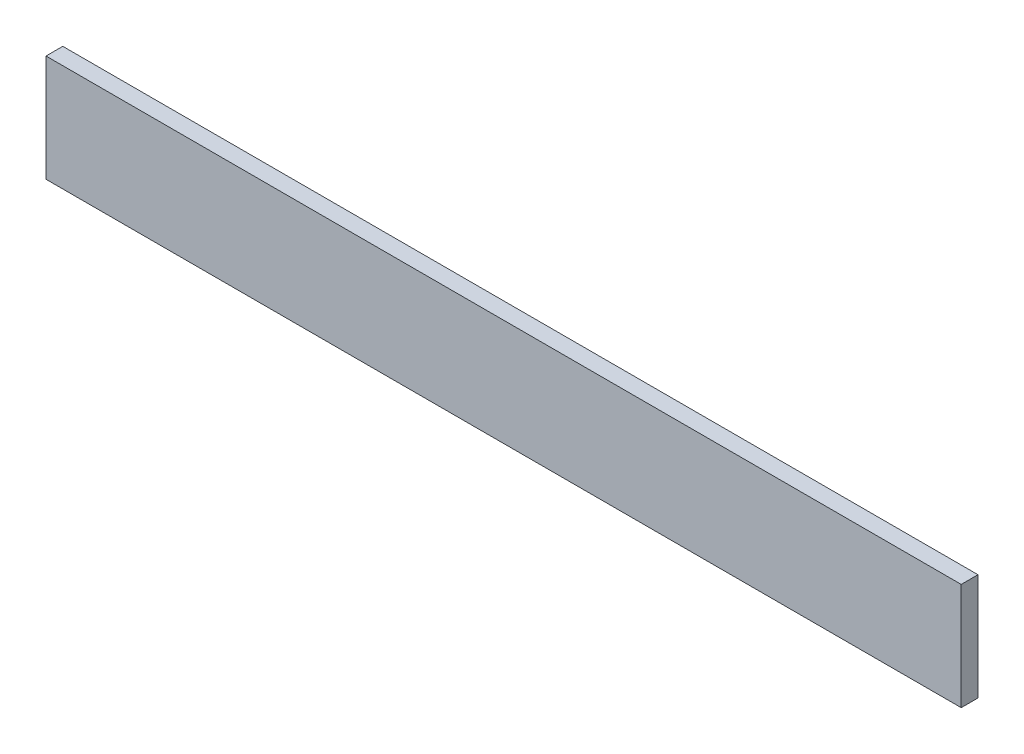
ISO-10303-21;
HEADER;
FILE_DESCRIPTION(('STEP AP214'),'2;1');
FILE_NAME('part.step','',(''),(''),'','','');
FILE_SCHEMA(('AUTOMOTIVE_DESIGN { 1 0 10303 214 1 1 1 1 }'));
ENDSEC;
DATA;
#1=APPLICATION_CONTEXT('core data for automotive mechanical design processes');
#2=APPLICATION_PROTOCOL_DEFINITION('international standard','automotive_design',2000,#1);
#3=PRODUCT_CONTEXT('',#1,'mechanical');
#4=PRODUCT('Part','Part','',(#3));
#5=PRODUCT_RELATED_PRODUCT_CATEGORY('part','',(#4));
#6=PRODUCT_DEFINITION_FORMATION('','',#4);
#7=PRODUCT_DEFINITION_CONTEXT('part definition',#1,'design');
#8=PRODUCT_DEFINITION('design','',#6,#7);
#9=PRODUCT_DEFINITION_SHAPE('','',#8);
#10=(LENGTH_UNIT() NAMED_UNIT(*) SI_UNIT(.MILLI.,.METRE.));
#11=(NAMED_UNIT(*) PLANE_ANGLE_UNIT() SI_UNIT($,.RADIAN.));
#12=(NAMED_UNIT(*) SI_UNIT($,.STERADIAN.) SOLID_ANGLE_UNIT());
#13=UNCERTAINTY_MEASURE_WITH_UNIT(LENGTH_MEASURE(1.E-05),#10,'distance_accuracy_value','');
#14=(GEOMETRIC_REPRESENTATION_CONTEXT(3) GLOBAL_UNCERTAINTY_ASSIGNED_CONTEXT((#13)) GLOBAL_UNIT_ASSIGNED_CONTEXT((#10,
#11,#12)) REPRESENTATION_CONTEXT('',''));
#15=CARTESIAN_POINT('',(0.,0.,0.));
#16=DIRECTION('',(0.,0.,1.));
#17=DIRECTION('',(1.,0.,0.));
#18=AXIS2_PLACEMENT_3D('',#15,#16,#17);
#19=CARTESIAN_POINT('',(-600.,70.,22.));
#20=DIRECTION('',(1.,0.,0.));
#21=DIRECTION('',(0.,0.,-1.));
#22=AXIS2_PLACEMENT_3D('',#19,#20,#21);
#23=PLANE('',#22);
#24=DIRECTION('',(0.,-1.,0.));
#25=VECTOR('',#24,1.);
#26=CARTESIAN_POINT('',(-600.,70.,0.));
#27=LINE('',#26,#25);
#28=CARTESIAN_POINT('',(-600.,70.,0.));
#29=VERTEX_POINT('',#28);
#30=CARTESIAN_POINT('',(-600.,-70.,0.));
#31=VERTEX_POINT('',#30);
#32=EDGE_CURVE('E83',#29,#31,#27,.T.);
#33=ORIENTED_EDGE('',*,*,#32,.T.);
#34=DIRECTION('',(0.,0.,-1.));
#35=VECTOR('',#34,1.);
#36=CARTESIAN_POINT('',(-600.,-70.,22.));
#37=LINE('',#36,#35);
#38=CARTESIAN_POINT('',(-600.,-70.,22.));
#39=VERTEX_POINT('',#38);
#40=EDGE_CURVE('E11',#39,#31,#37,.T.);
#41=ORIENTED_EDGE('',*,*,#40,.F.);
#42=DIRECTION('',(0.,-1.,0.));
#43=VECTOR('',#42,1.);
#44=CARTESIAN_POINT('',(-600.,70.,22.));
#45=LINE('',#44,#43);
#46=CARTESIAN_POINT('',(-600.,70.,22.));
#47=VERTEX_POINT('',#46);
#48=EDGE_CURVE('E69',#47,#39,#45,.T.);
#49=ORIENTED_EDGE('',*,*,#48,.F.);
#50=DIRECTION('',(0.,0.,-1.));
#51=VECTOR('',#50,1.);
#52=CARTESIAN_POINT('',(-600.,70.,22.));
#53=LINE('',#52,#51);
#54=EDGE_CURVE('E77',#47,#29,#53,.T.);
#55=ORIENTED_EDGE('',*,*,#54,.T.);
#56=EDGE_LOOP('',(#33,#41,#49,#55));
#57=FACE_BOUND('',#56,.T.);
#58=ADVANCED_FACE('F18',(#57),#23,.F.);
#59=CARTESIAN_POINT('',(-600.,-70.,22.));
#60=DIRECTION('',(0.,1.,0.));
#61=DIRECTION('',(-1.,0.,0.));
#62=AXIS2_PLACEMENT_3D('',#59,#60,#61);
#63=PLANE('',#62);
#64=DIRECTION('',(1.,0.,0.));
#65=VECTOR('',#64,1.);
#66=CARTESIAN_POINT('',(-600.,-70.,0.));
#67=LINE('',#66,#65);
#68=CARTESIAN_POINT('',(600.,-70.,0.));
#69=VERTEX_POINT('',#68);
#70=EDGE_CURVE('E73',#31,#69,#67,.T.);
#71=ORIENTED_EDGE('',*,*,#70,.T.);
#72=DIRECTION('',(0.,0.,-1.));
#73=VECTOR('',#72,1.);
#74=CARTESIAN_POINT('',(600.,-70.,22.));
#75=LINE('',#74,#73);
#76=CARTESIAN_POINT('',(600.,-70.,22.));
#77=VERTEX_POINT('',#76);
#78=EDGE_CURVE('E26',#77,#69,#75,.T.);
#79=ORIENTED_EDGE('',*,*,#78,.F.);
#80=DIRECTION('',(1.,0.,0.));
#81=VECTOR('',#80,1.);
#82=CARTESIAN_POINT('',(-600.,-70.,22.));
#83=LINE('',#82,#81);
#84=EDGE_CURVE('E64',#39,#77,#83,.T.);
#85=ORIENTED_EDGE('',*,*,#84,.F.);
#86=ORIENTED_EDGE('',*,*,#40,.T.);
#87=EDGE_LOOP('',(#71,#79,#85,#86));
#88=FACE_BOUND('',#87,.T.);
#89=ADVANCED_FACE('F72',(#88),#63,.F.);
#90=CARTESIAN_POINT('',(600.,-70.,22.));
#91=DIRECTION('',(-1.,0.,0.));
#92=DIRECTION('',(0.,0.,1.));
#93=AXIS2_PLACEMENT_3D('',#90,#91,#92);
#94=PLANE('',#93);
#95=DIRECTION('',(0.,1.,0.));
#96=VECTOR('',#95,1.);
#97=CARTESIAN_POINT('',(600.,-70.,0.));
#98=LINE('',#97,#96);
#99=CARTESIAN_POINT('',(600.,70.,0.));
#100=VERTEX_POINT('',#99);
#101=EDGE_CURVE('E51',#69,#100,#98,.T.);
#102=ORIENTED_EDGE('',*,*,#101,.T.);
#103=DIRECTION('',(0.,0.,-1.));
#104=VECTOR('',#103,1.);
#105=CARTESIAN_POINT('',(600.,70.,22.));
#106=LINE('',#105,#104);
#107=CARTESIAN_POINT('',(600.,70.,22.));
#108=VERTEX_POINT('',#107);
#109=EDGE_CURVE('E74',#108,#100,#106,.T.);
#110=ORIENTED_EDGE('',*,*,#109,.F.);
#111=DIRECTION('',(0.,1.,0.));
#112=VECTOR('',#111,1.);
#113=CARTESIAN_POINT('',(600.,-70.,22.));
#114=LINE('',#113,#112);
#115=EDGE_CURVE('E67',#77,#108,#114,.T.);
#116=ORIENTED_EDGE('',*,*,#115,.F.);
#117=ORIENTED_EDGE('',*,*,#78,.T.);
#118=EDGE_LOOP('',(#102,#110,#116,#117));
#119=FACE_BOUND('',#118,.T.);
#120=ADVANCED_FACE('F75',(#119),#94,.F.);
#121=CARTESIAN_POINT('',(600.,70.,22.));
#122=DIRECTION('',(0.,-1.,0.));
#123=DIRECTION('',(1.,0.,0.));
#124=AXIS2_PLACEMENT_3D('',#121,#122,#123);
#125=PLANE('',#124);
#126=DIRECTION('',(-1.,0.,0.));
#127=VECTOR('',#126,1.);
#128=CARTESIAN_POINT('',(600.,70.,0.));
#129=LINE('',#128,#127);
#130=EDGE_CURVE('E57',#100,#29,#129,.T.);
#131=ORIENTED_EDGE('',*,*,#130,.T.);
#132=ORIENTED_EDGE('',*,*,#54,.F.);
#133=DIRECTION('',(-1.,0.,0.));
#134=VECTOR('',#133,1.);
#135=CARTESIAN_POINT('',(600.,70.,22.));
#136=LINE('',#135,#134);
#137=EDGE_CURVE('E34',#108,#47,#136,.T.);
#138=ORIENTED_EDGE('',*,*,#137,.F.);
#139=ORIENTED_EDGE('',*,*,#109,.T.);
#140=EDGE_LOOP('',(#131,#132,#138,#139));
#141=FACE_BOUND('',#140,.T.);
#142=ADVANCED_FACE('F92',(#141),#125,.F.);
#143=CARTESIAN_POINT('',(-600.,70.,22.));
#144=DIRECTION('',(0.,0.,-1.));
#145=DIRECTION('',(-1.,0.,0.));
#146=AXIS2_PLACEMENT_3D('',#143,#144,#145);
#147=PLANE('',#146);
#148=ORIENTED_EDGE('',*,*,#48,.T.);
#149=ORIENTED_EDGE('',*,*,#84,.T.);
#150=ORIENTED_EDGE('',*,*,#115,.T.);
#151=ORIENTED_EDGE('',*,*,#137,.T.);
#152=EDGE_LOOP('',(#148,#149,#150,#151));
#153=FACE_BOUND('',#152,.T.);
#154=ADVANCED_FACE('F65',(#153),#147,.F.);
#155=CARTESIAN_POINT('',(-600.,70.,0.));
#156=DIRECTION('',(0.,0.,-1.));
#157=DIRECTION('',(-1.,0.,0.));
#158=AXIS2_PLACEMENT_3D('',#155,#156,#157);
#159=PLANE('',#158);
#160=ORIENTED_EDGE('',*,*,#32,.F.);
#161=ORIENTED_EDGE('',*,*,#130,.F.);
#162=ORIENTED_EDGE('',*,*,#101,.F.);
#163=ORIENTED_EDGE('',*,*,#70,.F.);
#164=EDGE_LOOP('',(#160,#161,#162,#163));
#165=FACE_BOUND('',#164,.T.);
#166=ADVANCED_FACE('F95',(#165),#159,.T.);
#167=CLOSED_SHELL('',(#58,#89,#120,#142,#154,#166));
#168=MANIFOLD_SOLID_BREP('B1',#167);
#169=ADVANCED_BREP_SHAPE_REPRESENTATION('',(#18,#168),#14);
#170=SHAPE_DEFINITION_REPRESENTATION(#9,#169);
ENDSEC;
END-ISO-10303-21;
